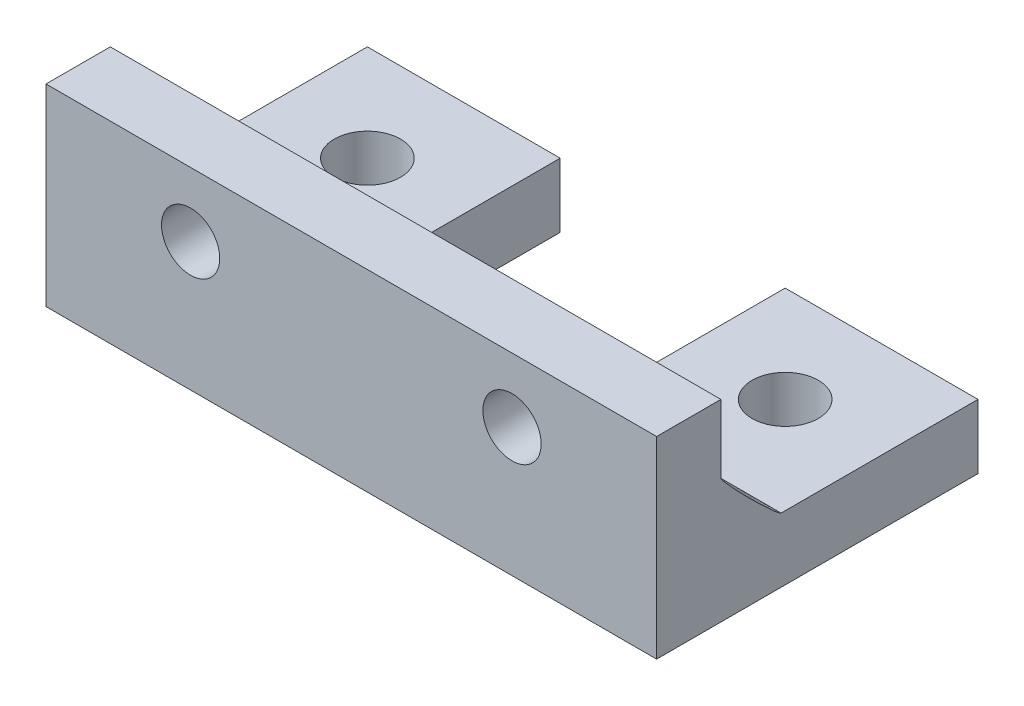
ISO-10303-21;
HEADER;
FILE_DESCRIPTION(('STEP AP214'),'2;1');
FILE_NAME('part.step','',(''),(''),'','','');
FILE_SCHEMA(('AUTOMOTIVE_DESIGN { 1 0 10303 214 1 1 1 1 }'));
ENDSEC;
DATA;
#1=APPLICATION_CONTEXT('core data for automotive mechanical design processes');
#2=APPLICATION_PROTOCOL_DEFINITION('international standard','automotive_design',2000,#1);
#3=PRODUCT_CONTEXT('',#1,'mechanical');
#4=PRODUCT('Part','Part','',(#3));
#5=PRODUCT_RELATED_PRODUCT_CATEGORY('part','',(#4));
#6=PRODUCT_DEFINITION_FORMATION('','',#4);
#7=PRODUCT_DEFINITION_CONTEXT('part definition',#1,'design');
#8=PRODUCT_DEFINITION('design','',#6,#7);
#9=PRODUCT_DEFINITION_SHAPE('','',#8);
#10=(LENGTH_UNIT() NAMED_UNIT(*) SI_UNIT(.MILLI.,.METRE.));
#11=(NAMED_UNIT(*) PLANE_ANGLE_UNIT() SI_UNIT($,.RADIAN.));
#12=(NAMED_UNIT(*) SI_UNIT($,.STERADIAN.) SOLID_ANGLE_UNIT());
#13=UNCERTAINTY_MEASURE_WITH_UNIT(LENGTH_MEASURE(1.E-05),#10,'distance_accuracy_value','');
#14=(GEOMETRIC_REPRESENTATION_CONTEXT(3) GLOBAL_UNCERTAINTY_ASSIGNED_CONTEXT((#13)) GLOBAL_UNIT_ASSIGNED_CONTEXT((#10,
#11,#12)) REPRESENTATION_CONTEXT('',''));
#15=CARTESIAN_POINT('',(0.,0.,0.));
#16=DIRECTION('',(0.,0.,1.));
#17=DIRECTION('',(1.,0.,0.));
#18=AXIS2_PLACEMENT_3D('',#15,#16,#17);
#19=CARTESIAN_POINT('',(7.2,6.4,-17.6));
#20=DIRECTION('',(0.,0.,1.));
#21=DIRECTION('',(1.,0.,0.));
#22=AXIS2_PLACEMENT_3D('',#19,#20,#21);
#23=CYLINDRICAL_SURFACE('',#22,1.45);
#24=CARTESIAN_POINT('',(7.2,6.4,6.4));
#25=DIRECTION('',(0.,0.,1.));
#26=DIRECTION('',(1.,0.,0.));
#27=AXIS2_PLACEMENT_3D('',#24,#25,#26);
#28=CIRCLE('',#27,1.45);
#29=CARTESIAN_POINT('',(8.65,6.4,6.4));
#30=VERTEX_POINT('',#29);
#31=EDGE_CURVE('E305',#30,#30,#28,.T.);
#32=ORIENTED_EDGE('',*,*,#31,.T.);
#33=EDGE_LOOP('',(#32));
#34=FACE_BOUND('',#33,.T.);
#35=CARTESIAN_POINT('',(7.2,6.4,3.2));
#36=DIRECTION('',(0.,0.,1.));
#37=DIRECTION('',(1.,0.,0.));
#38=AXIS2_PLACEMENT_3D('',#35,#36,#37);
#39=CIRCLE('',#38,1.45);
#40=CARTESIAN_POINT('',(8.65,6.4,3.2));
#41=VERTEX_POINT('',#40);
#42=EDGE_CURVE('E308',#41,#41,#39,.T.);
#43=ORIENTED_EDGE('',*,*,#42,.F.);
#44=EDGE_LOOP('',(#43));
#45=FACE_BOUND('',#44,.T.);
#46=ADVANCED_FACE('F36',(#34,#45),#23,.F.);
#47=CARTESIAN_POINT('',(23.2,6.4,-17.6));
#48=DIRECTION('',(0.,0.,1.));
#49=DIRECTION('',(1.,0.,0.));
#50=AXIS2_PLACEMENT_3D('',#47,#48,#49);
#51=CYLINDRICAL_SURFACE('',#50,1.45);
#52=CARTESIAN_POINT('',(23.2,6.4,6.4));
#53=DIRECTION('',(0.,0.,1.));
#54=DIRECTION('',(1.,0.,0.));
#55=AXIS2_PLACEMENT_3D('',#52,#53,#54);
#56=CIRCLE('',#55,1.45);
#57=CARTESIAN_POINT('',(24.65,6.4,6.4));
#58=VERTEX_POINT('',#57);
#59=EDGE_CURVE('E428',#58,#58,#56,.T.);
#60=ORIENTED_EDGE('',*,*,#59,.T.);
#61=EDGE_LOOP('',(#60));
#62=FACE_BOUND('',#61,.T.);
#63=CARTESIAN_POINT('',(23.2,6.4,3.2));
#64=DIRECTION('',(0.,0.,1.));
#65=DIRECTION('',(1.,0.,0.));
#66=AXIS2_PLACEMENT_3D('',#63,#64,#65);
#67=CIRCLE('',#66,1.45);
#68=CARTESIAN_POINT('',(24.65,6.4,3.2));
#69=VERTEX_POINT('',#68);
#70=EDGE_CURVE('E315',#69,#69,#67,.T.);
#71=ORIENTED_EDGE('',*,*,#70,.F.);
#72=EDGE_LOOP('',(#71));
#73=FACE_BOUND('',#72,.T.);
#74=ADVANCED_FACE('F244',(#62,#73),#51,.F.);
#75=CARTESIAN_POINT('',(0.,3.2,0.));
#76=DIRECTION('',(1.,0.,0.));
#77=DIRECTION('',(0.,0.,-1.));
#78=AXIS2_PLACEMENT_3D('',#75,#76,#77);
#79=PLANE('',#78);
#80=DIRECTION('',(0.,0.,1.));
#81=VECTOR('',#80,1.);
#82=CARTESIAN_POINT('',(0.,0.,0.));
#83=LINE('',#82,#81);
#84=CARTESIAN_POINT('',(0.,0.,-9.6));
#85=VERTEX_POINT('',#84);
#86=CARTESIAN_POINT('',(0.,0.,6.4));
#87=VERTEX_POINT('',#86);
#88=EDGE_CURVE('E388',#85,#87,#83,.T.);
#89=ORIENTED_EDGE('',*,*,#88,.T.);
#90=DIRECTION('',(0.,-1.,0.));
#91=VECTOR('',#90,1.);
#92=CARTESIAN_POINT('',(0.,3.2,6.4));
#93=LINE('',#92,#91);
#94=CARTESIAN_POINT('',(0.,9.6,6.4));
#95=VERTEX_POINT('',#94);
#96=EDGE_CURVE('E333',#95,#87,#93,.T.);
#97=ORIENTED_EDGE('',*,*,#96,.F.);
#98=DIRECTION('',(0.,0.,1.));
#99=VECTOR('',#98,1.);
#100=CARTESIAN_POINT('',(0.,9.6,6.4));
#101=LINE('',#100,#99);
#102=CARTESIAN_POINT('',(0.,9.6,3.2));
#103=VERTEX_POINT('',#102);
#104=EDGE_CURVE('E310',#103,#95,#101,.T.);
#105=ORIENTED_EDGE('',*,*,#104,.F.);
#106=DIRECTION('',(0.,-1.,0.));
#107=VECTOR('',#106,1.);
#108=CARTESIAN_POINT('',(0.,9.6,3.2));
#109=LINE('',#108,#107);
#110=CARTESIAN_POINT('',(0.,6.2,3.2));
#111=VERTEX_POINT('',#110);
#112=EDGE_CURVE('E325',#103,#111,#109,.T.);
#113=ORIENTED_EDGE('',*,*,#112,.T.);
#114=CARTESIAN_POINT('',(0.,3.2,0.200000000000001));
#115=CARTESIAN_POINT('',(0.,3.2,3.2));
#116=CARTESIAN_POINT('',(0.,6.2,3.2));
#117=(BOUNDED_CURVE() B_SPLINE_CURVE(2,(#114,#115,#116),.UNSPECIFIED.,.F.,
.F.) B_SPLINE_CURVE_WITH_KNOTS((3,3),(0.,1.),
.UNSPECIFIED.) CURVE() GEOMETRIC_REPRESENTATION_ITEM() RATIONAL_B_SPLINE_CURVE((1.,
0.0526315789473684,1.)) REPRESENTATION_ITEM(''));
#118=CARTESIAN_POINT('',(0.,3.2,0.200000000000001));
#119=VERTEX_POINT('',#118);
#120=EDGE_CURVE('E59',#111,#119,#117,.F.);
#121=ORIENTED_EDGE('',*,*,#120,.T.);
#122=DIRECTION('',(0.,0.,1.));
#123=VECTOR('',#122,1.);
#124=CARTESIAN_POINT('',(0.,3.2,0.));
#125=LINE('',#124,#123);
#126=CARTESIAN_POINT('',(0.,3.2,-9.6));
#127=VERTEX_POINT('',#126);
#128=EDGE_CURVE('E396',#127,#119,#125,.T.);
#129=ORIENTED_EDGE('',*,*,#128,.F.);
#130=DIRECTION('',(0.,1.,0.));
#131=VECTOR('',#130,1.);
#132=CARTESIAN_POINT('',(0.,0.,-9.6));
#133=LINE('',#132,#131);
#134=EDGE_CURVE('E385',#85,#127,#133,.T.);
#135=ORIENTED_EDGE('',*,*,#134,.F.);
#136=EDGE_LOOP('',(#89,#97,#105,#113,#121,#129,#135));
#137=FACE_BOUND('',#136,.T.);
#138=ADVANCED_FACE('F234',(#137),#79,.F.);
#139=CARTESIAN_POINT('',(0.,3.2,6.4));
#140=DIRECTION('',(0.,0.,-1.));
#141=DIRECTION('',(-1.,0.,0.));
#142=AXIS2_PLACEMENT_3D('',#139,#140,#141);
#143=PLANE('',#142);
#144=ORIENTED_EDGE('',*,*,#59,.F.);
#145=EDGE_LOOP('',(#144));
#146=FACE_BOUND('',#145,.T.);
#147=ORIENTED_EDGE('',*,*,#31,.F.);
#148=EDGE_LOOP('',(#147));
#149=FACE_BOUND('',#148,.T.);
#150=DIRECTION('',(1.,0.,0.));
#151=VECTOR('',#150,1.);
#152=CARTESIAN_POINT('',(0.,0.,6.4));
#153=LINE('',#152,#151);
#154=CARTESIAN_POINT('',(30.4,0.,6.4));
#155=VERTEX_POINT('',#154);
#156=EDGE_CURVE('E404',#87,#155,#153,.T.);
#157=ORIENTED_EDGE('',*,*,#156,.T.);
#158=DIRECTION('',(0.,-1.,0.));
#159=VECTOR('',#158,1.);
#160=CARTESIAN_POINT('',(30.4,3.2,6.4));
#161=LINE('',#160,#159);
#162=CARTESIAN_POINT('',(30.4,9.6,6.4));
#163=VERTEX_POINT('',#162);
#164=EDGE_CURVE('E407',#163,#155,#161,.T.);
#165=ORIENTED_EDGE('',*,*,#164,.F.);
#166=DIRECTION('',(1.,0.,0.));
#167=VECTOR('',#166,1.);
#168=CARTESIAN_POINT('',(0.,9.6,6.4));
#169=LINE('',#168,#167);
#170=EDGE_CURVE('E313',#95,#163,#169,.T.);
#171=ORIENTED_EDGE('',*,*,#170,.F.);
#172=ORIENTED_EDGE('',*,*,#96,.T.);
#173=EDGE_LOOP('',(#157,#165,#171,#172));
#174=FACE_BOUND('',#173,.T.);
#175=ADVANCED_FACE('F243',(#146,#149,#174),#143,.F.);
#176=CARTESIAN_POINT('',(30.4,3.2,0.));
#177=DIRECTION('',(-1.,0.,0.));
#178=DIRECTION('',(0.,0.,1.));
#179=AXIS2_PLACEMENT_3D('',#176,#177,#178);
#180=PLANE('',#179);
#181=DIRECTION('',(0.,0.,-1.));
#182=VECTOR('',#181,1.);
#183=CARTESIAN_POINT('',(30.4,0.,0.));
#184=LINE('',#183,#182);
#185=CARTESIAN_POINT('',(30.4,0.,-9.6));
#186=VERTEX_POINT('',#185);
#187=EDGE_CURVE('E399',#155,#186,#184,.T.);
#188=ORIENTED_EDGE('',*,*,#187,.T.);
#189=DIRECTION('',(0.,1.,0.));
#190=VECTOR('',#189,1.);
#191=CARTESIAN_POINT('',(30.4,0.,-9.6));
#192=LINE('',#191,#190);
#193=CARTESIAN_POINT('',(30.4,3.2,-9.6));
#194=VERTEX_POINT('',#193);
#195=EDGE_CURVE('E362',#186,#194,#192,.T.);
#196=ORIENTED_EDGE('',*,*,#195,.T.);
#197=DIRECTION('',(0.,0.,-1.));
#198=VECTOR('',#197,1.);
#199=CARTESIAN_POINT('',(30.4,3.2,0.));
#200=LINE('',#199,#198);
#201=CARTESIAN_POINT('',(30.4,3.2,0.200000000000001));
#202=VERTEX_POINT('',#201);
#203=EDGE_CURVE('E174',#202,#194,#200,.T.);
#204=ORIENTED_EDGE('',*,*,#203,.F.);
#205=CARTESIAN_POINT('',(30.4,6.2,3.2));
#206=CARTESIAN_POINT('',(30.4,3.2,3.2));
#207=CARTESIAN_POINT('',(30.4,3.2,0.2));
#208=(BOUNDED_CURVE() B_SPLINE_CURVE(2,(#205,#206,#207),.UNSPECIFIED.,.F.,
.F.) B_SPLINE_CURVE_WITH_KNOTS((3,3),(0.,1.),
.UNSPECIFIED.) CURVE() GEOMETRIC_REPRESENTATION_ITEM() RATIONAL_B_SPLINE_CURVE((1.,
0.0526315789473684,1.)) REPRESENTATION_ITEM(''));
#209=CARTESIAN_POINT('',(30.4,6.2,3.2));
#210=VERTEX_POINT('',#209);
#211=EDGE_CURVE('E427',#202,#210,#208,.F.);
#212=ORIENTED_EDGE('',*,*,#211,.T.);
#213=DIRECTION('',(0.,-1.,0.));
#214=VECTOR('',#213,1.);
#215=CARTESIAN_POINT('',(30.4,9.6,3.2));
#216=LINE('',#215,#214);
#217=CARTESIAN_POINT('',(30.4,9.6,3.2));
#218=VERTEX_POINT('',#217);
#219=EDGE_CURVE('E332',#218,#210,#216,.T.);
#220=ORIENTED_EDGE('',*,*,#219,.F.);
#221=DIRECTION('',(0.,0.,-1.));
#222=VECTOR('',#221,1.);
#223=CARTESIAN_POINT('',(30.4,9.6,6.4));
#224=LINE('',#223,#222);
#225=EDGE_CURVE('E321',#163,#218,#224,.T.);
#226=ORIENTED_EDGE('',*,*,#225,.F.);
#227=ORIENTED_EDGE('',*,*,#164,.T.);
#228=EDGE_LOOP('',(#188,#196,#204,#212,#220,#226,#227));
#229=FACE_BOUND('',#228,.T.);
#230=ADVANCED_FACE('F247',(#229),#180,.F.);
#231=CARTESIAN_POINT('',(0.,3.2,0.));
#232=DIRECTION('',(0.,0.,1.));
#233=DIRECTION('',(1.,0.,0.));
#234=AXIS2_PLACEMENT_3D('',#231,#232,#233);
#235=PLANE('',#234);
#236=DIRECTION('',(-1.,0.,0.));
#237=VECTOR('',#236,1.);
#238=CARTESIAN_POINT('',(0.,3.2,0.));
#239=LINE('',#238,#237);
#240=CARTESIAN_POINT('',(20.8,3.2,0.));
#241=VERTEX_POINT('',#240);
#242=CARTESIAN_POINT('',(9.6,3.2,0.));
#243=VERTEX_POINT('',#242);
#244=EDGE_CURVE('E398',#241,#243,#239,.T.);
#245=ORIENTED_EDGE('',*,*,#244,.F.);
#246=DIRECTION('',(0.,1.,0.));
#247=VECTOR('',#246,1.);
#248=CARTESIAN_POINT('',(20.8,0.,0.));
#249=LINE('',#248,#247);
#250=CARTESIAN_POINT('',(20.8,0.,0.));
#251=VERTEX_POINT('',#250);
#252=EDGE_CURVE('E354',#251,#241,#249,.T.);
#253=ORIENTED_EDGE('',*,*,#252,.F.);
#254=DIRECTION('',(-1.,0.,0.));
#255=VECTOR('',#254,1.);
#256=CARTESIAN_POINT('',(0.,0.,0.));
#257=LINE('',#256,#255);
#258=CARTESIAN_POINT('',(9.6,0.,0.));
#259=VERTEX_POINT('',#258);
#260=EDGE_CURVE('E397',#251,#259,#257,.T.);
#261=ORIENTED_EDGE('',*,*,#260,.T.);
#262=DIRECTION('',(0.,1.,0.));
#263=VECTOR('',#262,1.);
#264=CARTESIAN_POINT('',(9.6,0.,0.));
#265=LINE('',#264,#263);
#266=EDGE_CURVE('E380',#259,#243,#265,.T.);
#267=ORIENTED_EDGE('',*,*,#266,.T.);
#268=EDGE_LOOP('',(#245,#253,#261,#267));
#269=FACE_BOUND('',#268,.T.);
#270=ADVANCED_FACE('F219',(#269),#235,.F.);
#271=CARTESIAN_POINT('',(0.,3.2,0.));
#272=DIRECTION('',(0.,1.,0.));
#273=DIRECTION('',(0.,0.,1.));
#274=AXIS2_PLACEMENT_3D('',#271,#272,#273);
#275=PLANE('',#274);
#276=ORIENTED_EDGE('',*,*,#128,.T.);
#277=CARTESIAN_POINT('',(31.92,3.2,0.200000000000001));
#278=CARTESIAN_POINT('',(20.7733333333333,3.2,0.200000000000001));
#279=CARTESIAN_POINT('',(9.62666666666666,3.2,0.200000000000001));
#280=CARTESIAN_POINT('',(-1.52,3.2,0.200000000000001));
#281=(BOUNDED_CURVE() B_SPLINE_CURVE(3,(#277,#278,#279,#280),.UNSPECIFIED.,.F.,
.F.) B_SPLINE_CURVE_WITH_KNOTS((4,4),(-0.03192,0.00152),
.UNSPECIFIED.) CURVE() GEOMETRIC_REPRESENTATION_ITEM() RATIONAL_B_SPLINE_CURVE((1.,1.,1.,1.)) REPRESENTATION_ITEM(''));
#282=EDGE_CURVE('E67',#119,#202,#281,.F.);
#283=ORIENTED_EDGE('',*,*,#282,.T.);
#284=ORIENTED_EDGE('',*,*,#203,.T.);
#285=DIRECTION('',(-1.,0.,0.));
#286=VECTOR('',#285,1.);
#287=CARTESIAN_POINT('',(20.8,3.2,-9.6));
#288=LINE('',#287,#286);
#289=CARTESIAN_POINT('',(20.8,3.2,-9.6));
#290=VERTEX_POINT('',#289);
#291=EDGE_CURVE('E351',#194,#290,#288,.T.);
#292=ORIENTED_EDGE('',*,*,#291,.T.);
#293=DIRECTION('',(0.,0.,1.));
#294=VECTOR('',#293,1.);
#295=CARTESIAN_POINT('',(20.8,3.2,0.));
#296=LINE('',#295,#294);
#297=EDGE_CURVE('E345',#290,#241,#296,.T.);
#298=ORIENTED_EDGE('',*,*,#297,.T.);
#299=ORIENTED_EDGE('',*,*,#244,.T.);
#300=DIRECTION('',(0.,0.,-1.));
#301=VECTOR('',#300,1.);
#302=CARTESIAN_POINT('',(9.6,3.2,0.));
#303=LINE('',#302,#301);
#304=CARTESIAN_POINT('',(9.6,3.2,-9.6));
#305=VERTEX_POINT('',#304);
#306=EDGE_CURVE('E370',#243,#305,#303,.T.);
#307=ORIENTED_EDGE('',*,*,#306,.T.);
#308=DIRECTION('',(-1.,0.,0.));
#309=VECTOR('',#308,1.);
#310=CARTESIAN_POINT('',(0.,3.2,-9.6));
#311=LINE('',#310,#309);
#312=EDGE_CURVE('E377',#305,#127,#311,.T.);
#313=ORIENTED_EDGE('',*,*,#312,.T.);
#314=EDGE_LOOP('',(#276,#283,#284,#292,#298,#299,#307,#313));
#315=FACE_BOUND('',#314,.T.);
#316=CARTESIAN_POINT('',(4.8,3.2,-4.8));
#317=DIRECTION('',(0.,1.,0.));
#318=DIRECTION('',(0.,0.,1.));
#319=AXIS2_PLACEMENT_3D('',#316,#317,#318);
#320=CIRCLE('',#319,1.65);
#321=CARTESIAN_POINT('',(4.8,3.2,-3.15));
#322=VERTEX_POINT('',#321);
#323=EDGE_CURVE('E361',#322,#322,#320,.T.);
#324=ORIENTED_EDGE('',*,*,#323,.F.);
#325=EDGE_LOOP('',(#324));
#326=FACE_BOUND('',#325,.T.);
#327=CARTESIAN_POINT('',(25.6,3.2,-4.8));
#328=DIRECTION('',(0.,1.,0.));
#329=DIRECTION('',(0.,0.,1.));
#330=AXIS2_PLACEMENT_3D('',#327,#328,#329);
#331=CIRCLE('',#330,1.65);
#332=CARTESIAN_POINT('',(25.6,3.2,-3.15));
#333=VERTEX_POINT('',#332);
#334=EDGE_CURVE('E336',#333,#333,#331,.T.);
#335=ORIENTED_EDGE('',*,*,#334,.F.);
#336=EDGE_LOOP('',(#335));
#337=FACE_BOUND('',#336,.T.);
#338=ADVANCED_FACE('F215',(#315,#326,#337),#275,.T.);
#339=CARTESIAN_POINT('',(0.,0.,0.));
#340=DIRECTION('',(0.,1.,0.));
#341=DIRECTION('',(0.,0.,1.));
#342=AXIS2_PLACEMENT_3D('',#339,#340,#341);
#343=PLANE('',#342);
#344=ORIENTED_EDGE('',*,*,#88,.F.);
#345=DIRECTION('',(-1.,0.,0.));
#346=VECTOR('',#345,1.);
#347=CARTESIAN_POINT('',(0.,0.,-9.6));
#348=LINE('',#347,#346);
#349=CARTESIAN_POINT('',(9.6,0.,-9.6));
#350=VERTEX_POINT('',#349);
#351=EDGE_CURVE('E376',#350,#85,#348,.T.);
#352=ORIENTED_EDGE('',*,*,#351,.F.);
#353=DIRECTION('',(0.,0.,-1.));
#354=VECTOR('',#353,1.);
#355=CARTESIAN_POINT('',(9.6,0.,0.));
#356=LINE('',#355,#354);
#357=EDGE_CURVE('E373',#259,#350,#356,.T.);
#358=ORIENTED_EDGE('',*,*,#357,.F.);
#359=ORIENTED_EDGE('',*,*,#260,.F.);
#360=DIRECTION('',(0.,0.,1.));
#361=VECTOR('',#360,1.);
#362=CARTESIAN_POINT('',(20.8,0.,0.));
#363=LINE('',#362,#361);
#364=CARTESIAN_POINT('',(20.8,0.,-9.6));
#365=VERTEX_POINT('',#364);
#366=EDGE_CURVE('E347',#365,#251,#363,.T.);
#367=ORIENTED_EDGE('',*,*,#366,.F.);
#368=DIRECTION('',(-1.,0.,0.));
#369=VECTOR('',#368,1.);
#370=CARTESIAN_POINT('',(20.8,0.,-9.6));
#371=LINE('',#370,#369);
#372=EDGE_CURVE('E350',#186,#365,#371,.T.);
#373=ORIENTED_EDGE('',*,*,#372,.F.);
#374=ORIENTED_EDGE('',*,*,#187,.F.);
#375=ORIENTED_EDGE('',*,*,#156,.F.);
#376=EDGE_LOOP('',(#344,#352,#358,#359,#367,#373,#374,#375));
#377=FACE_BOUND('',#376,.T.);
#378=CARTESIAN_POINT('',(4.8,0.,-4.8));
#379=DIRECTION('',(0.,1.,0.));
#380=DIRECTION('',(0.,0.,1.));
#381=AXIS2_PLACEMENT_3D('',#378,#379,#380);
#382=CIRCLE('',#381,1.65);
#383=CARTESIAN_POINT('',(4.8,0.,-3.15));
#384=VERTEX_POINT('',#383);
#385=EDGE_CURVE('E367',#384,#384,#382,.T.);
#386=ORIENTED_EDGE('',*,*,#385,.T.);
#387=EDGE_LOOP('',(#386));
#388=FACE_BOUND('',#387,.T.);
#389=CARTESIAN_POINT('',(25.6,0.,-4.8));
#390=DIRECTION('',(0.,1.,0.));
#391=DIRECTION('',(0.,0.,1.));
#392=AXIS2_PLACEMENT_3D('',#389,#390,#391);
#393=CIRCLE('',#392,1.65);
#394=CARTESIAN_POINT('',(25.6,0.,-3.15));
#395=VERTEX_POINT('',#394);
#396=EDGE_CURVE('E340',#395,#395,#393,.T.);
#397=ORIENTED_EDGE('',*,*,#396,.T.);
#398=EDGE_LOOP('',(#397));
#399=FACE_BOUND('',#398,.T.);
#400=ADVANCED_FACE('F210',(#377,#388,#399),#343,.F.);
#401=CARTESIAN_POINT('',(0.,0.,-9.6));
#402=DIRECTION('',(0.,0.,-1.));
#403=DIRECTION('',(-1.,0.,0.));
#404=AXIS2_PLACEMENT_3D('',#401,#402,#403);
#405=PLANE('',#404);
#406=ORIENTED_EDGE('',*,*,#312,.F.);
#407=DIRECTION('',(0.,1.,0.));
#408=VECTOR('',#407,1.);
#409=CARTESIAN_POINT('',(9.6,0.,-9.6));
#410=LINE('',#409,#408);
#411=EDGE_CURVE('E389',#350,#305,#410,.T.);
#412=ORIENTED_EDGE('',*,*,#411,.F.);
#413=ORIENTED_EDGE('',*,*,#351,.T.);
#414=ORIENTED_EDGE('',*,*,#134,.T.);
#415=EDGE_LOOP('',(#406,#412,#413,#414));
#416=FACE_BOUND('',#415,.T.);
#417=ADVANCED_FACE('F207',(#416),#405,.T.);
#418=CARTESIAN_POINT('',(9.6,0.,0.));
#419=DIRECTION('',(1.,0.,0.));
#420=DIRECTION('',(0.,0.,-1.));
#421=AXIS2_PLACEMENT_3D('',#418,#419,#420);
#422=PLANE('',#421);
#423=ORIENTED_EDGE('',*,*,#306,.F.);
#424=ORIENTED_EDGE('',*,*,#266,.F.);
#425=ORIENTED_EDGE('',*,*,#357,.T.);
#426=ORIENTED_EDGE('',*,*,#411,.T.);
#427=EDGE_LOOP('',(#423,#424,#425,#426));
#428=FACE_BOUND('',#427,.T.);
#429=ADVANCED_FACE('F205',(#428),#422,.T.);
#430=CARTESIAN_POINT('',(4.8,0.,-4.8));
#431=DIRECTION('',(0.,1.,0.));
#432=DIRECTION('',(0.,0.,1.));
#433=AXIS2_PLACEMENT_3D('',#430,#431,#432);
#434=CYLINDRICAL_SURFACE('',#433,1.65);
#435=ORIENTED_EDGE('',*,*,#385,.F.);
#436=EDGE_LOOP('',(#435));
#437=FACE_BOUND('',#436,.T.);
#438=ORIENTED_EDGE('',*,*,#323,.T.);
#439=EDGE_LOOP('',(#438));
#440=FACE_BOUND('',#439,.T.);
#441=ADVANCED_FACE('F201',(#437,#440),#434,.F.);
#442=CARTESIAN_POINT('',(20.8,0.,0.));
#443=DIRECTION('',(-1.,0.,0.));
#444=DIRECTION('',(0.,0.,1.));
#445=AXIS2_PLACEMENT_3D('',#442,#443,#444);
#446=PLANE('',#445);
#447=ORIENTED_EDGE('',*,*,#297,.F.);
#448=DIRECTION('',(0.,1.,0.));
#449=VECTOR('',#448,1.);
#450=CARTESIAN_POINT('',(20.8,0.,-9.6));
#451=LINE('',#450,#449);
#452=EDGE_CURVE('E359',#365,#290,#451,.T.);
#453=ORIENTED_EDGE('',*,*,#452,.F.);
#454=ORIENTED_EDGE('',*,*,#366,.T.);
#455=ORIENTED_EDGE('',*,*,#252,.T.);
#456=EDGE_LOOP('',(#447,#453,#454,#455));
#457=FACE_BOUND('',#456,.T.);
#458=ADVANCED_FACE('F197',(#457),#446,.T.);
#459=CARTESIAN_POINT('',(20.8,0.,-9.6));
#460=DIRECTION('',(0.,0.,-1.));
#461=DIRECTION('',(-1.,0.,0.));
#462=AXIS2_PLACEMENT_3D('',#459,#460,#461);
#463=PLANE('',#462);
#464=ORIENTED_EDGE('',*,*,#291,.F.);
#465=ORIENTED_EDGE('',*,*,#195,.F.);
#466=ORIENTED_EDGE('',*,*,#372,.T.);
#467=ORIENTED_EDGE('',*,*,#452,.T.);
#468=EDGE_LOOP('',(#464,#465,#466,#467));
#469=FACE_BOUND('',#468,.T.);
#470=ADVANCED_FACE('F193',(#469),#463,.T.);
#471=CARTESIAN_POINT('',(25.6,0.,-4.8));
#472=DIRECTION('',(0.,1.,0.));
#473=DIRECTION('',(0.,0.,1.));
#474=AXIS2_PLACEMENT_3D('',#471,#472,#473);
#475=CYLINDRICAL_SURFACE('',#474,1.65);
#476=ORIENTED_EDGE('',*,*,#396,.F.);
#477=EDGE_LOOP('',(#476));
#478=FACE_BOUND('',#477,.T.);
#479=ORIENTED_EDGE('',*,*,#334,.T.);
#480=EDGE_LOOP('',(#479));
#481=FACE_BOUND('',#480,.T.);
#482=ADVANCED_FACE('F189',(#478,#481),#475,.F.);
#483=CARTESIAN_POINT('',(0.,9.6,3.2));
#484=DIRECTION('',(0.,0.,1.));
#485=DIRECTION('',(1.,0.,0.));
#486=AXIS2_PLACEMENT_3D('',#483,#484,#485);
#487=PLANE('',#486);
#488=CARTESIAN_POINT('',(-1.52,6.2,3.2));
#489=CARTESIAN_POINT('',(9.62666666666666,6.2,3.2));
#490=CARTESIAN_POINT('',(20.7733333333333,6.2,3.2));
#491=CARTESIAN_POINT('',(31.92,6.2,3.2));
#492=(BOUNDED_CURVE() B_SPLINE_CURVE(3,(#488,#489,#490,#491),.UNSPECIFIED.,.F.,
.F.) B_SPLINE_CURVE_WITH_KNOTS((4,4),(-0.03192,0.00152),
.UNSPECIFIED.) CURVE() GEOMETRIC_REPRESENTATION_ITEM() RATIONAL_B_SPLINE_CURVE((1.,1.,1.,1.)) REPRESENTATION_ITEM(''));
#493=CARTESIAN_POINT('',(20.4572823696195,6.2,3.2));
#494=VERTEX_POINT('',#493);
#495=CARTESIAN_POINT('',(9.9427176303805,6.2,3.2));
#496=VERTEX_POINT('',#495);
#497=EDGE_CURVE('E151',#494,#496,#492,.F.);
#498=ORIENTED_EDGE('',*,*,#497,.T.);
#499=CARTESIAN_POINT('',(7.2,6.4,3.2));
#500=DIRECTION('',(0.,0.,-1.));
#501=DIRECTION('',(-1.,0.,0.));
#502=AXIS2_PLACEMENT_3D('',#499,#500,#501);
#503=CIRCLE('',#502,2.75);
#504=CARTESIAN_POINT('',(4.4572823696195,6.2,3.2));
#505=VERTEX_POINT('',#504);
#506=EDGE_CURVE('E141',#496,#505,#503,.T.);
#507=ORIENTED_EDGE('',*,*,#506,.T.);
#508=CARTESIAN_POINT('',(-1.52,6.2,3.2));
#509=CARTESIAN_POINT('',(9.62666666666666,6.2,3.2));
#510=CARTESIAN_POINT('',(20.7733333333333,6.2,3.2));
#511=CARTESIAN_POINT('',(31.92,6.2,3.2));
#512=(BOUNDED_CURVE() B_SPLINE_CURVE(3,(#508,#509,#510,#511),.UNSPECIFIED.,.F.,
.F.) B_SPLINE_CURVE_WITH_KNOTS((4,4),(-0.03192,0.00152),
.UNSPECIFIED.) CURVE() GEOMETRIC_REPRESENTATION_ITEM() RATIONAL_B_SPLINE_CURVE((1.,1.,1.,1.)) REPRESENTATION_ITEM(''));
#513=EDGE_CURVE('E153',#505,#111,#512,.F.);
#514=ORIENTED_EDGE('',*,*,#513,.T.);
#515=ORIENTED_EDGE('',*,*,#112,.F.);
#516=DIRECTION('',(-1.,0.,0.));
#517=VECTOR('',#516,1.);
#518=CARTESIAN_POINT('',(0.,9.6,3.2));
#519=LINE('',#518,#517);
#520=EDGE_CURVE('E323',#218,#103,#519,.T.);
#521=ORIENTED_EDGE('',*,*,#520,.F.);
#522=ORIENTED_EDGE('',*,*,#219,.T.);
#523=CARTESIAN_POINT('',(-1.52,6.2,3.2));
#524=CARTESIAN_POINT('',(9.62666666666666,6.2,3.2));
#525=CARTESIAN_POINT('',(20.7733333333333,6.2,3.2));
#526=CARTESIAN_POINT('',(31.92,6.2,3.2));
#527=(BOUNDED_CURVE() B_SPLINE_CURVE(3,(#523,#524,#525,#526),.UNSPECIFIED.,.F.,
.F.) B_SPLINE_CURVE_WITH_KNOTS((4,4),(-0.03192,0.00152),
.UNSPECIFIED.) CURVE() GEOMETRIC_REPRESENTATION_ITEM() RATIONAL_B_SPLINE_CURVE((1.,1.,1.,1.)) REPRESENTATION_ITEM(''));
#528=CARTESIAN_POINT('',(25.9427176303805,6.2,3.2));
#529=VERTEX_POINT('',#528);
#530=EDGE_CURVE('E160',#210,#529,#527,.F.);
#531=ORIENTED_EDGE('',*,*,#530,.T.);
#532=CARTESIAN_POINT('',(23.2,6.4,3.2));
#533=DIRECTION('',(0.,0.,-1.));
#534=DIRECTION('',(-1.,0.,0.));
#535=AXIS2_PLACEMENT_3D('',#532,#533,#534);
#536=CIRCLE('',#535,2.75);
#537=EDGE_CURVE('E146',#529,#494,#536,.T.);
#538=ORIENTED_EDGE('',*,*,#537,.T.);
#539=EDGE_LOOP('',(#498,#507,#514,#515,#521,#522,#531,#538));
#540=FACE_BOUND('',#539,.T.);
#541=ORIENTED_EDGE('',*,*,#70,.T.);
#542=EDGE_LOOP('',(#541));
#543=FACE_BOUND('',#542,.T.);
#544=ORIENTED_EDGE('',*,*,#42,.T.);
#545=EDGE_LOOP('',(#544));
#546=FACE_BOUND('',#545,.T.);
#547=ADVANCED_FACE('F157',(#540,#543,#546),#487,.F.);
#548=CARTESIAN_POINT('',(0.,9.6,0.));
#549=DIRECTION('',(0.,-1.,0.));
#550=DIRECTION('',(0.,0.,-1.));
#551=AXIS2_PLACEMENT_3D('',#548,#549,#550);
#552=PLANE('',#551);
#553=ORIENTED_EDGE('',*,*,#104,.T.);
#554=ORIENTED_EDGE('',*,*,#170,.T.);
#555=ORIENTED_EDGE('',*,*,#225,.T.);
#556=ORIENTED_EDGE('',*,*,#520,.T.);
#557=EDGE_LOOP('',(#553,#554,#555,#556));
#558=FACE_BOUND('',#557,.T.);
#559=ADVANCED_FACE('F188',(#558),#552,.F.);
#560=CARTESIAN_POINT('',(31.92,6.2,3.2));
#561=CARTESIAN_POINT('',(20.7733333333333,6.2,3.2));
#562=CARTESIAN_POINT('',(9.62666666666666,6.2,3.2));
#563=CARTESIAN_POINT('',(-1.52,6.2,3.2));
#564=CARTESIAN_POINT('',(31.92,3.2,3.2));
#565=CARTESIAN_POINT('',(20.7733333333333,3.2,3.2));
#566=CARTESIAN_POINT('',(9.62666666666666,3.2,3.2));
#567=CARTESIAN_POINT('',(-1.52,3.2,3.2));
#568=CARTESIAN_POINT('',(31.92,3.2,0.200000000000001));
#569=CARTESIAN_POINT('',(20.7733333333333,3.2,0.200000000000001));
#570=CARTESIAN_POINT('',(9.62666666666666,3.2,0.200000000000001));
#571=CARTESIAN_POINT('',(-1.52,3.2,0.200000000000001));
#572=(BOUNDED_SURFACE() B_SPLINE_SURFACE(2,3,((#560,#561,#562,#563),(#564,#565,#566,#567),(#568,
#569,#570,#571)),.UNSPECIFIED.,.F.,.F.,.F.) B_SPLINE_SURFACE_WITH_KNOTS((3,3),(4,4),(0.,1.),
(-0.03192,0.00152),
.UNSPECIFIED.) GEOMETRIC_REPRESENTATION_ITEM() RATIONAL_B_SPLINE_SURFACE(((1.,1.,1.,1.),
(0.0526315789473684,0.0526315789473684,0.0526315789473684,0.0526315789473684),(1.,1.,1.,1.))) REPRESENTATION_ITEM('') SURFACE());
#573=CARTESIAN_POINT('',(4.45728236961951,6.2,3.2));
#574=CARTESIAN_POINT('',(4.45738595241681,6.19857949295034,3.1999820922404));
#575=CARTESIAN_POINT('',(4.45748942273489,6.19717575617066,3.19982334996162));
#576=CARTESIAN_POINT('',(4.45769508688601,6.19441386595851,3.19931767588066));
#577=CARTESIAN_POINT('',(4.45779728368454,6.19305541133311,3.19897249504877));
#578=CARTESIAN_POINT('',(4.45810985778245,6.1889402791099,3.1977638271457));
#579=CARTESIAN_POINT('',(4.45831956317754,6.18623487721231,3.19673979718442));
#580=CARTESIAN_POINT('',(4.45874004730021,6.18090869754408,3.19448756073331));
#581=CARTESIAN_POINT('',(4.45895082736128,6.17828811161202,3.19325892541718));
#582=CARTESIAN_POINT('',(4.45959332080581,6.17043705218405,3.18935128181988));
#583=CARTESIAN_POINT('',(4.46002870251333,6.16530218818105,3.18648324948375));
#584=CARTESIAN_POINT('',(4.46134536777359,6.15025750542638,3.17762384850064));
#585=CARTESIAN_POINT('',(4.46224927258778,6.14055066328731,3.17130292319545));
#586=CARTESIAN_POINT('',(4.46413235644149,6.12139550318869,3.1582751026346));
#587=CARTESIAN_POINT('',(4.46511163457219,6.1119475484827,3.1515677023053));
#588=CARTESIAN_POINT('',(4.46713836235516,6.09331729120361,3.13798498611209));
#589=CARTESIAN_POINT('',(4.4681850856404,6.08413332731364,3.13111183801209));
#590=CARTESIAN_POINT('',(4.4703556143541,6.06589566215608,3.11721872187019));
#591=CARTESIAN_POINT('',(4.47147937457677,6.05684188820259,3.11019884158475));
#592=CARTESIAN_POINT('',(4.47496689044223,6.0298318837201,3.08898363215665));
#593=CARTESIAN_POINT('',(4.47744784934328,6.01201812491397,3.07462613841337));
#594=CARTESIAN_POINT('',(4.48272367875809,5.97664581887792,3.04564975887587));
#595=CARTESIAN_POINT('',(4.4855186284971,5.9590873373267,3.0310308078974));
#596=CARTESIAN_POINT('',(4.49439161364637,5.90659713956636,2.98681997532353));
#597=CARTESIAN_POINT('',(4.50094281237042,5.87196567437182,2.95696659187));
#598=CARTESIAN_POINT('',(4.52255127354005,5.76853175053415,2.86657327659049));
#599=CARTESIAN_POINT('',(4.53951304860642,5.70057240140232,2.80551675371747));
#600=CARTESIAN_POINT('',(4.57847110744844,5.56635596982112,2.68310521038763));
#601=CARTESIAN_POINT('',(4.60046914164812,5.50009948815411,2.62175009342395));
#602=CARTESIAN_POINT('',(4.64954456728395,5.36919048533156,2.49921319423442));
#603=CARTESIAN_POINT('',(4.67662695870343,5.3045396146162,2.43803164333326));
#604=CARTESIAN_POINT('',(4.73591198660491,5.17700567848694,2.31632159507537));
#605=CARTESIAN_POINT('',(4.76811445235731,5.11412255420954,2.25579307601504));
#606=CARTESIAN_POINT('',(4.8458838462531,4.97581056650969,2.12170536933641));
#607=CARTESIAN_POINT('',(4.89281528922971,4.9008841704767,2.04840672258286));
#608=CARTESIAN_POINT('',(4.99483052467296,4.75449189263096,1.90409372056689));
#609=CARTESIAN_POINT('',(5.0499167843931,4.68302706683726,1.83308006457567));
#610=CARTESIAN_POINT('',(5.22770829381228,4.47495629936873,1.62483679770283));
#611=CARTESIAN_POINT('',(5.36319029333817,4.34422702006395,1.49196924871861));
#612=CARTESIAN_POINT('',(5.61210186545891,4.15150916366968,1.29352244148965));
#613=CARTESIAN_POINT('',(5.71470206808877,4.08214392254153,1.22141366719409));
#614=CARTESIAN_POINT('',(5.93390121296058,3.95552301525925,1.08867766536));
#615=CARTESIAN_POINT('',(6.05047984544321,3.89825010612823,1.02803410217243));
#616=CARTESIAN_POINT('',(6.27434164979838,3.80820203747477,0.93194249214123));
#617=CARTESIAN_POINT('',(6.37945762688144,3.77286568020928,0.893917862334594));
#618=CARTESIAN_POINT('',(6.54239901240882,3.72918840973055,0.846674339094213));
#619=CARTESIAN_POINT('',(6.59759962650188,3.71618257827405,0.832557314049977));
#620=CARTESIAN_POINT('',(6.70945272880605,3.69350523683748,0.807886594034154));
#621=CARTESIAN_POINT('',(6.76610455860121,3.68383224255886,0.79733131286244));
#622=CARTESIAN_POINT('',(6.88089822907582,3.66795746570958,0.77998170475928));
#623=CARTESIAN_POINT('',(6.93904795384801,3.66178168057949,0.773215549311942));
#624=CARTESIAN_POINT('',(7.05592850320317,3.65315168988315,0.763754439186738));
#625=CARTESIAN_POINT('',(7.11465905572208,3.65069581793403,0.761057661580847));
#626=CARTESIAN_POINT('',(7.23220563634155,3.64956085724107,0.759811853991785));
#627=CARTESIAN_POINT('',(7.29102166644675,3.6508818585502,0.761262922906786));
#628=CARTESIAN_POINT('',(7.40818686948326,3.65726287648039,0.7682624188946));
#629=CARTESIAN_POINT('',(7.46653606512139,3.66232271011335,0.773810645441939));
#630=CARTESIAN_POINT('',(7.62787001661189,3.68149973562005,0.794793438358186));
#631=CARTESIAN_POINT('',(7.72986444870519,3.69961067271742,0.814571635886045));
#632=CARTESIAN_POINT('',(7.92847449540728,3.74627099248808,0.865193470138843));
#633=CARTESIAN_POINT('',(8.02508759615808,3.77482520732781,0.896042229153799));
#634=CARTESIAN_POINT('',(8.24780418069991,3.85374043011456,0.980671828723089));
#635=CARTESIAN_POINT('',(8.3708211952828,3.90826392662868,1.0387065672103));
#636=CARTESIAN_POINT('',(8.60244649616564,4.03084173764739,1.16782132355864));
#637=CARTESIAN_POINT('',(8.71102162865916,4.09892631936827,1.23893049466608));
#638=CARTESIAN_POINT('',(8.95288792048768,4.27396947781768,1.41995825457994));
#639=CARTESIAN_POINT('',(9.07940564538258,4.38575723431312,1.53422490770588));
#640=CARTESIAN_POINT('',(9.30547510624486,4.62336879696588,1.77387724116402));
#641=CARTESIAN_POINT('',(9.40501117798918,4.74920069688072,1.89926932455115));
#642=CARTESIAN_POINT('',(9.54787227495877,4.96464031175912,2.11084442504474));
#643=CARTESIAN_POINT('',(9.59861685075908,5.05128155523438,2.19517404808567));
#644=CARTESIAN_POINT('',(9.68979916133779,5.22812547997319,2.36542156183161));
#645=CARTESIAN_POINT('',(9.73025073513965,5.31832318894659,2.45133715160046));
#646=CARTESIAN_POINT('',(9.78334016732293,5.45593502173551,2.58049354026117));
#647=CARTESIAN_POINT('',(9.79975394967452,5.50212395249575,2.62353121776915));
#648=CARTESIAN_POINT('',(9.83009783003132,5.59533372406731,2.70957679284237));
#649=CARTESIAN_POINT('',(9.84402820466833,5.64235447157867,2.75258469319224));
#650=CARTESIAN_POINT('',(9.86939780949615,5.73725685283332,2.83831487262817));
#651=CARTESIAN_POINT('',(9.88083888255047,5.78513782111848,2.88103734015546));
#652=CARTESIAN_POINT('',(9.89613277220764,5.8578010360787,2.94460869236459));
#653=CARTESIAN_POINT('',(9.90091974900151,5.88216433278828,2.96571537634314));
#654=CARTESIAN_POINT('',(9.90986804452288,5.93123774787045,3.00765596877796));
#655=CARTESIAN_POINT('',(9.91402940571116,5.95594784258114,3.02848989565866));
#656=CARTESIAN_POINT('',(9.92059641258909,5.99853615147175,3.06365174364817));
#657=CARTESIAN_POINT('',(9.92315914995973,6.01629382625896,3.07809664915475));
#658=CARTESIAN_POINT('',(9.92797031354898,6.05214102171974,3.10662030380675));
#659=CARTESIAN_POINT('',(9.93021881243506,6.07023046457394,3.1206991369912));
#660=CARTESIAN_POINT('',(9.9333969967633,6.09811892269952,3.14152417602534));
#661=CARTESIAN_POINT('',(9.93443980001444,6.10770948014415,3.148532607665));
#662=CARTESIAN_POINT('',(9.93644336544732,6.12710259654497,3.16223397286869));
#663=CARTESIAN_POINT('',(9.93740426921617,6.13690475133756,3.16892744157717));
#664=CARTESIAN_POINT('',(9.93879365949635,6.15193821847308,3.17851149561011));
#665=CARTESIAN_POINT('',(9.93924919143862,6.15701740019405,3.18163732344734));
#666=CARTESIAN_POINT('',(9.94014691710171,6.1673584966931,3.18764402778531));
#667=CARTESIAN_POINT('',(9.94058904416872,6.17262111035136,3.19052377939849));
#668=CARTESIAN_POINT('',(9.94124214652379,6.18068610363902,3.19437873556548));
#669=CARTESIAN_POINT('',(9.94145650252171,6.1833808885209,3.19557853652202));
#670=CARTESIAN_POINT('',(9.94188349823105,6.18885464758383,3.19771825626672));
#671=CARTESIAN_POINT('',(9.94209613465357,6.19163256461929,3.19866056035521));
#672=CARTESIAN_POINT('',(9.94237747017989,6.19538665006338,3.19950340652877));
#673=CARTESIAN_POINT('',(9.94244524185331,6.19629694569594,3.19967582370581));
#674=CARTESIAN_POINT('',(9.94258125194461,6.19813633666944,3.19992251993112));
#675=CARTESIAN_POINT('',(9.94264949040945,6.1990655176592,3.19999612518481));
#676=CARTESIAN_POINT('',(9.9427176303805,6.2,3.2));
#677=B_SPLINE_CURVE_WITH_KNOTS('',3,(#573,#574,#575,#576,#577,#578,#579,#580,#581,#582,#583,
#584,#585,#586,#587,#588,#589,#590,#591,#592,#593,#594,#595,#596,#597,#598,#599,#600,#601,#602,
#603,#604,#605,#606,#607,#608,#609,#610,#611,#612,#613,#614,#615,#616,#617,#618,#619,#620,#621,
#622,#623,#624,#625,#626,#627,#628,#629,#630,#631,#632,#633,#634,#635,#636,#637,#638,#639,#640,
#641,#642,#643,#644,#645,#646,#647,#648,#649,#650,#651,#652,#653,#654,#655,#656,#657,#658,#659,
#660,#661,#662,#663,#664,#665,#666,#667,#668,#669,#670,#671,#672,#673,#674,#675,#676),
.UNSPECIFIED.,.F.,.F.,(4,2,2,2,2,2,2,2,2,2,2,2,2,2,2,2,2,2,2,2,2,2,2,2,2,2,2,2,2,2,2,2,2,2,2,2,
2,2,2,2,2,2,2,2,2,2,2,2,2,2,2,4),(0.,0.00424491575119109,0.00845064077356473,0.0171343093787713,
0.0258364123242103,0.0435129459843629,0.0783469199909359,0.113227498253228,0.147780591629158,
0.182313579758502,0.251346340033496,0.320396557739848,0.458941700749648,0.737526749033049,
1.01620877093374,1.29516629954729,1.57411452823234,1.91825298124133,2.26249576752111,
2.94899243382587,3.37764879147936,3.80568971862911,4.15586055652829,4.33099998043443,
4.50606130384665,4.6824074614912,4.85867459922237,5.03494593977124,5.21120865371722,
5.52611102067393,5.84115927954173,6.27833684117529,6.71650130690408,7.32480537911357,
7.93346185012386,8.32641142691958,8.71882985448668,8.9144814351813,9.11011120821549,
9.30559565735535,9.40335311848278,9.50110394177478,9.5702017203437,9.63928349355695,
9.67505402125872,9.71076139882271,9.7287041481993,9.74672496177196,9.75559555841532,
9.76438095968306,9.76716329083609,9.7699644998272),.UNSPECIFIED.);
#678=EDGE_CURVE('E12',#505,#496,#677,.T.);
#679=CARTESIAN_POINT('',(20.4572823696195,6.2,3.2));
#680=CARTESIAN_POINT('',(20.4573859524168,6.19857949295034,3.1999820922404));
#681=CARTESIAN_POINT('',(20.4574894227349,6.19717575617066,3.19982334996163));
#682=CARTESIAN_POINT('',(20.457695086886,6.19441386595851,3.19931767588066));
#683=CARTESIAN_POINT('',(20.4577972836845,6.19305541133311,3.19897249504877));
#684=CARTESIAN_POINT('',(20.4581098577824,6.1889402791099,3.1977638271457));
#685=CARTESIAN_POINT('',(20.4583195631775,6.1862348772123,3.19673979718442));
#686=CARTESIAN_POINT('',(20.4587400473002,6.18090869754408,3.19448756073331));
#687=CARTESIAN_POINT('',(20.4589508273613,6.17828811161202,3.19325892541718));
#688=CARTESIAN_POINT('',(20.4595933208058,6.17043705218405,3.18935128181988));
#689=CARTESIAN_POINT('',(20.4600287025133,6.16530218818105,3.18648324948375));
#690=CARTESIAN_POINT('',(20.4613453677736,6.15025750542638,3.17762384850064));
#691=CARTESIAN_POINT('',(20.4622492725878,6.1405506632873,3.17130292319545));
#692=CARTESIAN_POINT('',(20.4641323564415,6.12139550318869,3.1582751026346));
#693=CARTESIAN_POINT('',(20.4651116345722,6.1119475484827,3.1515677023053));
#694=CARTESIAN_POINT('',(20.4671383623552,6.09331729120361,3.13798498611209));
#695=CARTESIAN_POINT('',(20.4681850856404,6.08413332731364,3.13111183801209));
#696=CARTESIAN_POINT('',(20.4703556143541,6.06589566215608,3.11721872187019));
#697=CARTESIAN_POINT('',(20.4714793745768,6.05684188820259,3.11019884158475));
#698=CARTESIAN_POINT('',(20.4749668904422,6.0298318837201,3.08898363215665));
#699=CARTESIAN_POINT('',(20.4774478493433,6.01201812491397,3.07462613841337));
#700=CARTESIAN_POINT('',(20.4827236787581,5.97664581887792,3.04564975887587));
#701=CARTESIAN_POINT('',(20.4855186284971,5.9590873373267,3.0310308078974));
#702=CARTESIAN_POINT('',(20.4943916136464,5.90659713956636,2.98681997532353));
#703=CARTESIAN_POINT('',(20.5009428123704,5.87196567437182,2.95696659187001));
#704=CARTESIAN_POINT('',(20.5225512735401,5.76853175053415,2.86657327659049));
#705=CARTESIAN_POINT('',(20.5395130486064,5.70057240140232,2.80551675371746));
#706=CARTESIAN_POINT('',(20.5784711074484,5.56635596982112,2.68310521038763));
#707=CARTESIAN_POINT('',(20.6004691416481,5.50009948815411,2.62175009342394));
#708=CARTESIAN_POINT('',(20.649544567284,5.36919048533156,2.49921319423442));
#709=CARTESIAN_POINT('',(20.6766269587034,5.3045396146162,2.43803164333326));
#710=CARTESIAN_POINT('',(20.7359119866049,5.17700567848694,2.31632159507537));
#711=CARTESIAN_POINT('',(20.7681144523573,5.11412255420954,2.25579307601504));
#712=CARTESIAN_POINT('',(20.8458838462531,4.97581056650969,2.12170536933641));
#713=CARTESIAN_POINT('',(20.8928152892297,4.9008841704767,2.04840672258286));
#714=CARTESIAN_POINT('',(20.994830524673,4.75449189263096,1.90409372056688));
#715=CARTESIAN_POINT('',(21.0499167843931,4.68302706683726,1.83308006457566));
#716=CARTESIAN_POINT('',(21.2277082938123,4.47495629936873,1.62483679770282));
#717=CARTESIAN_POINT('',(21.3631902933382,4.34422702006395,1.4919692487186));
#718=CARTESIAN_POINT('',(21.6121018654589,4.15150916366968,1.29352244148965));
#719=CARTESIAN_POINT('',(21.7147020680888,4.08214392254153,1.2214136671941));
#720=CARTESIAN_POINT('',(21.9339012129606,3.95552301525926,1.08867766536));
#721=CARTESIAN_POINT('',(22.0504798454432,3.89825010612823,1.02803410217244));
#722=CARTESIAN_POINT('',(22.2743416497984,3.80820203747477,0.931942492141231));
#723=CARTESIAN_POINT('',(22.3794576268814,3.77286568020929,0.893917862334596));
#724=CARTESIAN_POINT('',(22.5423990124088,3.72918840973055,0.846674339094218));
#725=CARTESIAN_POINT('',(22.5975996265019,3.71618257827406,0.832557314049983));
#726=CARTESIAN_POINT('',(22.709452728806,3.69350523683748,0.807886594034159));
#727=CARTESIAN_POINT('',(22.7661045586012,3.68383224255886,0.797331312862443));
#728=CARTESIAN_POINT('',(22.8808982290758,3.66795746570958,0.779981704759281));
#729=CARTESIAN_POINT('',(22.939047953848,3.66178168057949,0.773215549311943));
#730=CARTESIAN_POINT('',(23.0559285032032,3.65315168988316,0.763754439186741));
#731=CARTESIAN_POINT('',(23.1146590557221,3.65069581793403,0.76105766158085));
#732=CARTESIAN_POINT('',(23.2322056363415,3.64956085724108,0.759811853991788));
#733=CARTESIAN_POINT('',(23.2910216664467,3.6508818585502,0.761262922906788));
#734=CARTESIAN_POINT('',(23.4081868694833,3.65726287648039,0.768262418894601));
#735=CARTESIAN_POINT('',(23.4665360651214,3.66232271011335,0.77381064544194));
#736=CARTESIAN_POINT('',(23.6278700166119,3.68149973562005,0.794793438358187));
#737=CARTESIAN_POINT('',(23.7298644487052,3.69961067271742,0.814571635886047));
#738=CARTESIAN_POINT('',(23.9284744954073,3.74627099248809,0.865193470138844));
#739=CARTESIAN_POINT('',(24.0250875961581,3.77482520732781,0.896042229153799));
#740=CARTESIAN_POINT('',(24.2478041806999,3.85374043011456,0.980671828723087));
#741=CARTESIAN_POINT('',(24.3708211952828,3.90826392662868,1.0387065672103));
#742=CARTESIAN_POINT('',(24.6024464961656,4.03084173764739,1.16782132355864));
#743=CARTESIAN_POINT('',(24.7110216286592,4.09892631936827,1.23893049466608));
#744=CARTESIAN_POINT('',(24.9528879204877,4.27396947781768,1.41995825457994));
#745=CARTESIAN_POINT('',(25.0794056453826,4.38575723431312,1.53422490770588));
#746=CARTESIAN_POINT('',(25.3054751062449,4.62336879696587,1.77387724116401));
#747=CARTESIAN_POINT('',(25.4050111779892,4.74920069688071,1.89926932455114));
#748=CARTESIAN_POINT('',(25.5478722749588,4.96464031175911,2.11084442504473));
#749=CARTESIAN_POINT('',(25.5986168507591,5.05128155523437,2.19517404808566));
#750=CARTESIAN_POINT('',(25.6897991613378,5.22812547997318,2.36542156183159));
#751=CARTESIAN_POINT('',(25.7302507351396,5.31832318894657,2.45133715160045));
#752=CARTESIAN_POINT('',(25.7833401673229,5.45593502173549,2.58049354026116));
#753=CARTESIAN_POINT('',(25.7997539496745,5.50212395249573,2.62353121776914));
#754=CARTESIAN_POINT('',(25.8300978300313,5.59533372406729,2.70957679284235));
#755=CARTESIAN_POINT('',(25.8440282046683,5.64235447157865,2.75258469319222));
#756=CARTESIAN_POINT('',(25.8693978094961,5.7372568528333,2.83831487262815));
#757=CARTESIAN_POINT('',(25.8808388825505,5.78513782111846,2.88103734015544));
#758=CARTESIAN_POINT('',(25.8961327722076,5.85780103607868,2.94460869236457));
#759=CARTESIAN_POINT('',(25.9009197490015,5.88216433278826,2.96571537634312));
#760=CARTESIAN_POINT('',(25.9098680445229,5.93123774787043,3.00765596877794));
#761=CARTESIAN_POINT('',(25.9140294057111,5.95594784258112,3.02848989565864));
#762=CARTESIAN_POINT('',(25.9205964125891,5.99853615147173,3.06365174364815));
#763=CARTESIAN_POINT('',(25.9231591499597,6.01629382625894,3.07809664915473));
#764=CARTESIAN_POINT('',(25.927970313549,6.05214102171972,3.10662030380674));
#765=CARTESIAN_POINT('',(25.930218812435,6.07023046457392,3.1206991369912));
#766=CARTESIAN_POINT('',(25.9333969967633,6.09811892269952,3.14152417602533));
#767=CARTESIAN_POINT('',(25.9344398000144,6.10770948014414,3.14853260766499));
#768=CARTESIAN_POINT('',(25.9364433654473,6.12710259654496,3.16223397286868));
#769=CARTESIAN_POINT('',(25.9374042692162,6.13690475133756,3.16892744157717));
#770=CARTESIAN_POINT('',(25.9387936594964,6.15193821847307,3.1785114956101));
#771=CARTESIAN_POINT('',(25.9392491914386,6.15701740019405,3.18163732344734));
#772=CARTESIAN_POINT('',(25.9401469171017,6.16735849669309,3.18764402778531));
#773=CARTESIAN_POINT('',(25.9405890441687,6.17262111035135,3.19052377939849));
#774=CARTESIAN_POINT('',(25.9412421465238,6.18068610363902,3.19437873556547));
#775=CARTESIAN_POINT('',(25.9414565025217,6.1833808885209,3.19557853652202));
#776=CARTESIAN_POINT('',(25.941883498231,6.18885464758383,3.19771825626671));
#777=CARTESIAN_POINT('',(25.9420961346536,6.19163256461928,3.19866056035521));
#778=CARTESIAN_POINT('',(25.9423774701799,6.19538665006338,3.19950340652876));
#779=CARTESIAN_POINT('',(25.9424452418533,6.19629694569593,3.19967582370581));
#780=CARTESIAN_POINT('',(25.9425812519446,6.19813633666944,3.19992251993112));
#781=CARTESIAN_POINT('',(25.9426494904095,6.1990655176592,3.19999612518481));
#782=CARTESIAN_POINT('',(25.9427176303805,6.2,3.2));
#783=B_SPLINE_CURVE_WITH_KNOTS('',3,(#679,#680,#681,#682,#683,#684,#685,#686,#687,#688,#689,
#690,#691,#692,#693,#694,#695,#696,#697,#698,#699,#700,#701,#702,#703,#704,#705,#706,#707,#708,
#709,#710,#711,#712,#713,#714,#715,#716,#717,#718,#719,#720,#721,#722,#723,#724,#725,#726,#727,
#728,#729,#730,#731,#732,#733,#734,#735,#736,#737,#738,#739,#740,#741,#742,#743,#744,#745,#746,
#747,#748,#749,#750,#751,#752,#753,#754,#755,#756,#757,#758,#759,#760,#761,#762,#763,#764,#765,
#766,#767,#768,#769,#770,#771,#772,#773,#774,#775,#776,#777,#778,#779,#780,#781,#782),
.UNSPECIFIED.,.F.,.F.,(4,2,2,2,2,2,2,2,2,2,2,2,2,2,2,2,2,2,2,2,2,2,2,2,2,2,2,2,2,2,2,2,2,2,2,2,
2,2,2,2,2,2,2,2,2,2,2,2,2,2,2,4),(0.,0.00424491575119191,0.00845064077356722,0.0171343093787735,
0.0258364123242115,0.0435129459843636,0.0783469199909373,0.11322749825323,0.14778059162916,
0.182313579758504,0.251346340033496,0.320396557739848,0.458941700749647,0.73752674903305,
1.01620877093374,1.29516629954729,1.57411452823235,1.91825298124134,2.26249576752111,
2.94899243382587,3.37764879147935,3.8056897186291,4.15586055652828,4.33099998043442,
4.50606130384664,4.68240746149119,4.85867459922236,5.03494593977124,5.21120865371721,
5.52611102067392,5.84115927954172,6.27833684117528,6.71650130690406,7.32480537911355,
7.93346185012383,8.32641142691955,8.71882985448666,8.91448143518126,9.11011120821546,
9.30559565735531,9.40335311848275,9.50110394177474,9.57020172034367,9.63928349355693,
9.6750540212587,9.7107613988227,9.72870414819929,9.74672496177195,9.75559555841531,
9.76438095968304,9.76716329083608,9.7699644998272),.UNSPECIFIED.);
#784=EDGE_CURVE('E52',#494,#529,#783,.T.);
#785=ORIENTED_EDGE('',*,*,#513,.F.);
#786=ORIENTED_EDGE('',*,*,#678,.T.);
#787=ORIENTED_EDGE('',*,*,#497,.F.);
#788=ORIENTED_EDGE('',*,*,#784,.T.);
#789=ORIENTED_EDGE('',*,*,#530,.F.);
#790=ORIENTED_EDGE('',*,*,#211,.F.);
#791=ORIENTED_EDGE('',*,*,#282,.F.);
#792=ORIENTED_EDGE('',*,*,#120,.F.);
#793=EDGE_LOOP('',(#785,#786,#787,#788,#789,#790,#791,#792));
#794=FACE_BOUND('',#793,.T.);
#795=ADVANCED_FACE('F38',(#794),#572,.T.);
#796=CARTESIAN_POINT('',(23.2,6.4,3.2));
#797=DIRECTION('',(0.,0.,-1.));
#798=DIRECTION('',(-1.,0.,0.));
#799=AXIS2_PLACEMENT_3D('',#796,#797,#798);
#800=CYLINDRICAL_SURFACE('',#799,2.75);
#801=ORIENTED_EDGE('',*,*,#537,.F.);
#802=ORIENTED_EDGE('',*,*,#784,.F.);
#803=EDGE_LOOP('',(#801,#802));
#804=FACE_BOUND('',#803,.T.);
#805=ADVANCED_FACE('F290',(#804),#800,.F.);
#806=CARTESIAN_POINT('',(7.2,6.4,3.2));
#807=DIRECTION('',(0.,0.,-1.));
#808=DIRECTION('',(-1.,0.,0.));
#809=AXIS2_PLACEMENT_3D('',#806,#807,#808);
#810=CYLINDRICAL_SURFACE('',#809,2.75);
#811=ORIENTED_EDGE('',*,*,#506,.F.);
#812=ORIENTED_EDGE('',*,*,#678,.F.);
#813=EDGE_LOOP('',(#811,#812));
#814=FACE_BOUND('',#813,.T.);
#815=ADVANCED_FACE('F142',(#814),#810,.F.);
#816=CLOSED_SHELL('',(#46,#74,#138,#175,#230,#270,#338,#400,#417,#429,#441,#458,#470,#482,#547,
#559,#795,#805,#815));
#817=MANIFOLD_SOLID_BREP('B2',#816);
#818=ADVANCED_BREP_SHAPE_REPRESENTATION('',(#18,#817),#14);
#819=SHAPE_DEFINITION_REPRESENTATION(#9,#818);
ENDSEC;
END-ISO-10303-21;
